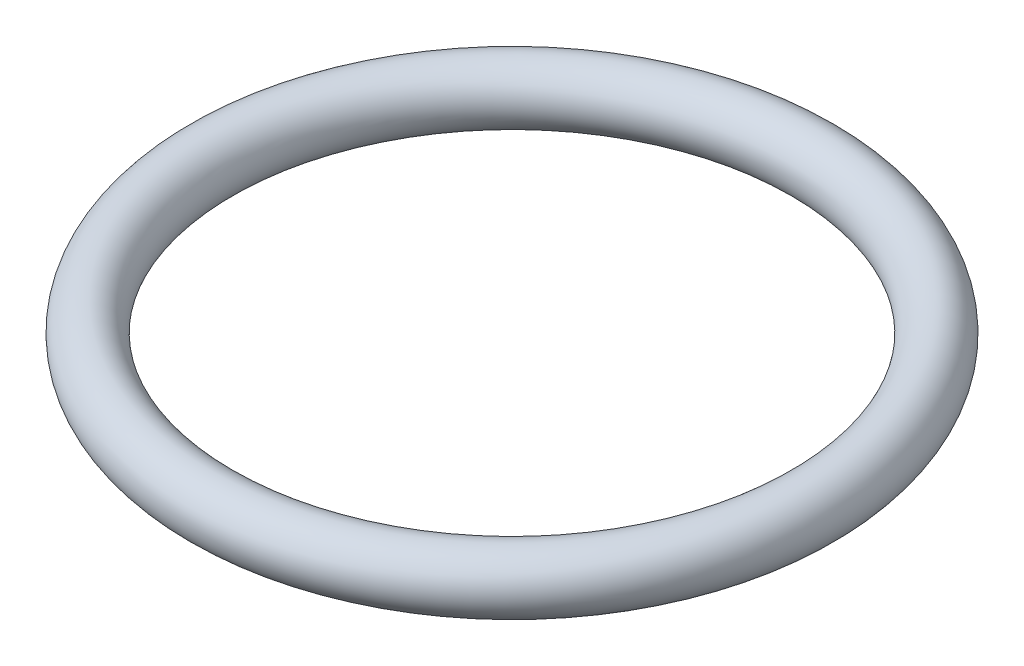
ISO-10303-21;
HEADER;
FILE_DESCRIPTION(('STEP AP214'),'2;1');
FILE_NAME('part.step','',(''),(''),'','','');
FILE_SCHEMA(('AUTOMOTIVE_DESIGN { 1 0 10303 214 1 1 1 1 }'));
ENDSEC;
DATA;
#1=APPLICATION_CONTEXT('core data for automotive mechanical design processes');
#2=APPLICATION_PROTOCOL_DEFINITION('international standard','automotive_design',2000,#1);
#3=PRODUCT_CONTEXT('',#1,'mechanical');
#4=PRODUCT('Part','Part','',(#3));
#5=PRODUCT_RELATED_PRODUCT_CATEGORY('part','',(#4));
#6=PRODUCT_DEFINITION_FORMATION('','',#4);
#7=PRODUCT_DEFINITION_CONTEXT('part definition',#1,'design');
#8=PRODUCT_DEFINITION('design','',#6,#7);
#9=PRODUCT_DEFINITION_SHAPE('','',#8);
#10=(LENGTH_UNIT() NAMED_UNIT(*) SI_UNIT(.MILLI.,.METRE.));
#11=(NAMED_UNIT(*) PLANE_ANGLE_UNIT() SI_UNIT($,.RADIAN.));
#12=(NAMED_UNIT(*) SI_UNIT($,.STERADIAN.) SOLID_ANGLE_UNIT());
#13=UNCERTAINTY_MEASURE_WITH_UNIT(LENGTH_MEASURE(1.E-05),#10,'distance_accuracy_value','');
#14=(GEOMETRIC_REPRESENTATION_CONTEXT(3) GLOBAL_UNCERTAINTY_ASSIGNED_CONTEXT((#13)) GLOBAL_UNIT_ASSIGNED_CONTEXT((#10,
#11,#12)) REPRESENTATION_CONTEXT('',''));
#15=CARTESIAN_POINT('',(0.,0.,0.));
#16=DIRECTION('',(0.,0.,1.));
#17=DIRECTION('',(1.,0.,0.));
#18=AXIS2_PLACEMENT_3D('',#15,#16,#17);
#19=CARTESIAN_POINT('',(0.,0.,0.));
#20=DIRECTION('',(0.,1.,0.));
#21=DIRECTION('',(0.,0.,1.));
#22=AXIS2_PLACEMENT_3D('',#19,#20,#21);
#23=TOROIDAL_SURFACE('',#22,10.2,1.);
#24=CARTESIAN_POINT('',(0.,0.,11.2));
#25=VERTEX_POINT('',#24);
#26=VERTEX_LOOP('',#25);
#27=FACE_BOUND('',#26,.T.);
#28=ADVANCED_FACE('F29',(#27),#23,.T.);
#29=CLOSED_SHELL('',(#28));
#30=MANIFOLD_SOLID_BREP('B2',#29);
#31=ADVANCED_BREP_SHAPE_REPRESENTATION('',(#18,#30),#14);
#32=SHAPE_DEFINITION_REPRESENTATION(#9,#31);
ENDSEC;
END-ISO-10303-21;
